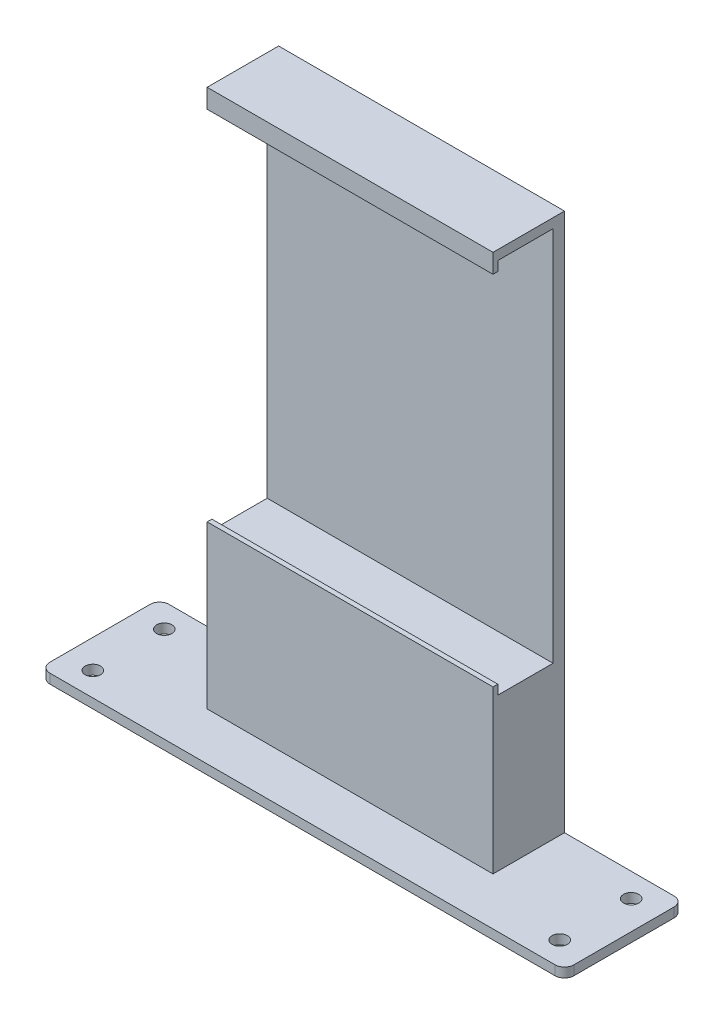
ISO-10303-21;
HEADER;
FILE_DESCRIPTION(('STEP AP214'),'2;1');
FILE_NAME('part.step','',(''),(''),'','','');
FILE_SCHEMA(('AUTOMOTIVE_DESIGN { 1 0 10303 214 1 1 1 1 }'));
ENDSEC;
DATA;
#1=APPLICATION_CONTEXT('core data for automotive mechanical design processes');
#2=APPLICATION_PROTOCOL_DEFINITION('international standard','automotive_design',2000,#1);
#3=PRODUCT_CONTEXT('',#1,'mechanical');
#4=PRODUCT('Part','Part','',(#3));
#5=PRODUCT_RELATED_PRODUCT_CATEGORY('part','',(#4));
#6=PRODUCT_DEFINITION_FORMATION('','',#4);
#7=PRODUCT_DEFINITION_CONTEXT('part definition',#1,'design');
#8=PRODUCT_DEFINITION('design','',#6,#7);
#9=PRODUCT_DEFINITION_SHAPE('','',#8);
#10=(LENGTH_UNIT() NAMED_UNIT(*) SI_UNIT(.MILLI.,.METRE.));
#11=(NAMED_UNIT(*) PLANE_ANGLE_UNIT() SI_UNIT($,.RADIAN.));
#12=(NAMED_UNIT(*) SI_UNIT($,.STERADIAN.) SOLID_ANGLE_UNIT());
#13=UNCERTAINTY_MEASURE_WITH_UNIT(LENGTH_MEASURE(1.E-05),#10,'distance_accuracy_value','');
#14=(GEOMETRIC_REPRESENTATION_CONTEXT(3) GLOBAL_UNCERTAINTY_ASSIGNED_CONTEXT((#13)) GLOBAL_UNIT_ASSIGNED_CONTEXT((#10,
#11,#12)) REPRESENTATION_CONTEXT('',''));
#15=CARTESIAN_POINT('',(0.,0.,0.));
#16=DIRECTION('',(0.,0.,1.));
#17=DIRECTION('',(1.,0.,0.));
#18=AXIS2_PLACEMENT_3D('',#15,#16,#17);
#19=CARTESIAN_POINT('',(-30.,-59.8465843842649,2.5));
#20=DIRECTION('',(0.,0.,1.));
#21=DIRECTION('',(1.,0.,0.));
#22=AXIS2_PLACEMENT_3D('',#19,#20,#21);
#23=PLANE('',#22);
#24=DIRECTION('',(1.,0.,0.));
#25=VECTOR('',#24,1.);
#26=CARTESIAN_POINT('',(-109.998499985937,36.,2.5));
#27=LINE('',#26,#25);
#28=CARTESIAN_POINT('',(-30.,36.,2.5));
#29=VERTEX_POINT('',#28);
#30=CARTESIAN_POINT('',(30.,36.,2.5));
#31=VERTEX_POINT('',#30);
#32=EDGE_CURVE('E224',#29,#31,#27,.T.);
#33=ORIENTED_EDGE('',*,*,#32,.F.);
#34=DIRECTION('',(0.,1.,0.));
#35=VECTOR('',#34,1.);
#36=CARTESIAN_POINT('',(-30.,-59.8465843842649,2.5));
#37=LINE('',#36,#35);
#38=CARTESIAN_POINT('',(-30.,2.,2.5));
#39=VERTEX_POINT('',#38);
#40=EDGE_CURVE('E195',#39,#29,#37,.T.);
#41=ORIENTED_EDGE('',*,*,#40,.F.);
#42=DIRECTION('',(-1.,0.,0.));
#43=VECTOR('',#42,1.);
#44=CARTESIAN_POINT('',(-30.,2.,2.5));
#45=LINE('',#44,#43);
#46=CARTESIAN_POINT('',(30.,2.,2.5));
#47=VERTEX_POINT('',#46);
#48=EDGE_CURVE('E232',#47,#39,#45,.T.);
#49=ORIENTED_EDGE('',*,*,#48,.F.);
#50=DIRECTION('',(0.,1.,0.));
#51=VECTOR('',#50,1.);
#52=CARTESIAN_POINT('',(30.,-59.8465843842649,2.5));
#53=LINE('',#52,#51);
#54=EDGE_CURVE('E253',#47,#31,#53,.T.);
#55=ORIENTED_EDGE('',*,*,#54,.T.);
#56=EDGE_LOOP('',(#33,#41,#49,#55));
#57=FACE_BOUND('',#56,.T.);
#58=ADVANCED_FACE('F36',(#57),#23,.T.);
#59=CARTESIAN_POINT('',(0.,2.,0.));
#60=DIRECTION('',(0.,1.,0.));
#61=DIRECTION('',(0.,0.,1.));
#62=AXIS2_PLACEMENT_3D('',#59,#60,#61);
#63=PLANE('',#62);
#64=CARTESIAN_POINT('',(49.,2.,7.5));
#65=DIRECTION('',(0.,1.,0.));
#66=DIRECTION('',(0.,0.,1.));
#67=AXIS2_PLACEMENT_3D('',#64,#65,#66);
#68=CIRCLE('',#67,1.6);
#69=CARTESIAN_POINT('',(49.,2.,9.1));
#70=VERTEX_POINT('',#69);
#71=EDGE_CURVE('E269',#70,#70,#68,.T.);
#72=ORIENTED_EDGE('',*,*,#71,.F.);
#73=EDGE_LOOP('',(#72));
#74=FACE_BOUND('',#73,.T.);
#75=CARTESIAN_POINT('',(-49.,2.,-7.5));
#76=DIRECTION('',(0.,1.,0.));
#77=DIRECTION('',(0.,0.,1.));
#78=AXIS2_PLACEMENT_3D('',#75,#76,#77);
#79=CIRCLE('',#78,1.6);
#80=CARTESIAN_POINT('',(-49.,2.,-5.9));
#81=VERTEX_POINT('',#80);
#82=EDGE_CURVE('E281',#81,#81,#79,.T.);
#83=ORIENTED_EDGE('',*,*,#82,.F.);
#84=EDGE_LOOP('',(#83));
#85=FACE_BOUND('',#84,.T.);
#86=CARTESIAN_POINT('',(49.,2.,-7.5));
#87=DIRECTION('',(0.,1.,0.));
#88=DIRECTION('',(0.,0.,-1.));
#89=AXIS2_PLACEMENT_3D('',#86,#87,#88);
#90=CIRCLE('',#89,1.6);
#91=CARTESIAN_POINT('',(49.,2.,-9.1));
#92=VERTEX_POINT('',#91);
#93=EDGE_CURVE('E275',#92,#92,#90,.T.);
#94=ORIENTED_EDGE('',*,*,#93,.F.);
#95=EDGE_LOOP('',(#94));
#96=FACE_BOUND('',#95,.T.);
#97=CARTESIAN_POINT('',(-49.,2.,7.5));
#98=DIRECTION('',(0.,1.,0.));
#99=DIRECTION('',(0.,0.,-1.));
#100=AXIS2_PLACEMENT_3D('',#97,#98,#99);
#101=CIRCLE('',#100,1.6);
#102=CARTESIAN_POINT('',(-49.,2.,5.9));
#103=VERTEX_POINT('',#102);
#104=EDGE_CURVE('E263',#103,#103,#101,.T.);
#105=ORIENTED_EDGE('',*,*,#104,.F.);
#106=EDGE_LOOP('',(#105));
#107=FACE_BOUND('',#106,.T.);
#108=DIRECTION('',(0.,0.,1.));
#109=VECTOR('',#108,1.);
#110=CARTESIAN_POINT('',(-55.,2.,-12.5));
#111=LINE('',#110,#109);
#112=CARTESIAN_POINT('',(-55.,2.,-10.5));
#113=VERTEX_POINT('',#112);
#114=CARTESIAN_POINT('',(-55.,2.,10.5));
#115=VERTEX_POINT('',#114);
#116=EDGE_CURVE('E294',#113,#115,#111,.T.);
#117=ORIENTED_EDGE('',*,*,#116,.T.);
#118=CARTESIAN_POINT('',(-53.,2.,10.5));
#119=DIRECTION('',(0.,1.,0.));
#120=DIRECTION('',(0.,0.,1.));
#121=AXIS2_PLACEMENT_3D('',#118,#119,#120);
#122=CIRCLE('',#121,2.);
#123=CARTESIAN_POINT('',(-53.,2.,12.5));
#124=VERTEX_POINT('',#123);
#125=EDGE_CURVE('E11',#115,#124,#122,.T.);
#126=ORIENTED_EDGE('',*,*,#125,.T.);
#127=DIRECTION('',(1.,0.,0.));
#128=VECTOR('',#127,1.);
#129=CARTESIAN_POINT('',(-55.,2.,12.5));
#130=LINE('',#129,#128);
#131=CARTESIAN_POINT('',(53.,2.,12.5));
#132=VERTEX_POINT('',#131);
#133=EDGE_CURVE('E296',#124,#132,#130,.T.);
#134=ORIENTED_EDGE('',*,*,#133,.T.);
#135=CARTESIAN_POINT('',(53.,2.,10.5));
#136=DIRECTION('',(0.,1.,0.));
#137=DIRECTION('',(0.,0.,1.));
#138=AXIS2_PLACEMENT_3D('',#135,#136,#137);
#139=CIRCLE('',#138,2.);
#140=CARTESIAN_POINT('',(55.,2.,10.5));
#141=VERTEX_POINT('',#140);
#142=EDGE_CURVE('E315',#132,#141,#139,.T.);
#143=ORIENTED_EDGE('',*,*,#142,.T.);
#144=DIRECTION('',(0.,0.,-1.));
#145=VECTOR('',#144,1.);
#146=CARTESIAN_POINT('',(55.,2.,-12.5));
#147=LINE('',#146,#145);
#148=CARTESIAN_POINT('',(55.,2.,-10.5));
#149=VERTEX_POINT('',#148);
#150=EDGE_CURVE('E287',#141,#149,#147,.T.);
#151=ORIENTED_EDGE('',*,*,#150,.T.);
#152=CARTESIAN_POINT('',(53.,2.,-10.5));
#153=DIRECTION('',(0.,1.,0.));
#154=DIRECTION('',(0.,0.,1.));
#155=AXIS2_PLACEMENT_3D('',#152,#153,#154);
#156=CIRCLE('',#155,2.);
#157=CARTESIAN_POINT('',(53.,2.,-12.5));
#158=VERTEX_POINT('',#157);
#159=EDGE_CURVE('E324',#149,#158,#156,.T.);
#160=ORIENTED_EDGE('',*,*,#159,.T.);
#161=DIRECTION('',(-1.,0.,0.));
#162=VECTOR('',#161,1.);
#163=CARTESIAN_POINT('',(-55.,2.,-12.5));
#164=LINE('',#163,#162);
#165=CARTESIAN_POINT('',(30.,2.,-12.5));
#166=VERTEX_POINT('',#165);
#167=EDGE_CURVE('E292',#158,#166,#164,.T.);
#168=ORIENTED_EDGE('',*,*,#167,.T.);
#169=DIRECTION('',(0.,0.,1.));
#170=VECTOR('',#169,1.);
#171=CARTESIAN_POINT('',(30.,2.,2.5));
#172=LINE('',#171,#170);
#173=EDGE_CURVE('E235',#166,#47,#172,.T.);
#174=ORIENTED_EDGE('',*,*,#173,.T.);
#175=ORIENTED_EDGE('',*,*,#48,.T.);
#176=DIRECTION('',(0.,0.,-1.));
#177=VECTOR('',#176,1.);
#178=CARTESIAN_POINT('',(-30.,2.,-12.5));
#179=LINE('',#178,#177);
#180=CARTESIAN_POINT('',(-30.,2.,-12.5));
#181=VERTEX_POINT('',#180);
#182=EDGE_CURVE('E239',#39,#181,#179,.T.);
#183=ORIENTED_EDGE('',*,*,#182,.T.);
#184=CARTESIAN_POINT('',(-53.,2.,-12.5));
#185=VERTEX_POINT('',#184);
#186=EDGE_CURVE('E290',#181,#185,#164,.T.);
#187=ORIENTED_EDGE('',*,*,#186,.T.);
#188=CARTESIAN_POINT('',(-53.,2.,-10.5));
#189=DIRECTION('',(0.,1.,0.));
#190=DIRECTION('',(0.,0.,1.));
#191=AXIS2_PLACEMENT_3D('',#188,#189,#190);
#192=CIRCLE('',#191,2.);
#193=EDGE_CURVE('E333',#185,#113,#192,.T.);
#194=ORIENTED_EDGE('',*,*,#193,.T.);
#195=EDGE_LOOP('',(#117,#126,#134,#143,#151,#160,#168,#174,#175,#183,#187,#194));
#196=FACE_BOUND('',#195,.T.);
#197=ADVANCED_FACE('F354',(#74,#85,#96,#107,#196),#63,.T.);
#198=CARTESIAN_POINT('',(0.,0.,0.));
#199=DIRECTION('',(0.,1.,0.));
#200=DIRECTION('',(0.,0.,1.));
#201=AXIS2_PLACEMENT_3D('',#198,#199,#200);
#202=PLANE('',#201);
#203=DIRECTION('',(1.,0.,0.));
#204=VECTOR('',#203,1.);
#205=CARTESIAN_POINT('',(-55.,0.,12.5));
#206=LINE('',#205,#204);
#207=CARTESIAN_POINT('',(-53.,0.,12.5));
#208=VERTEX_POINT('',#207);
#209=CARTESIAN_POINT('',(53.,0.,12.5));
#210=VERTEX_POINT('',#209);
#211=EDGE_CURVE('E291',#208,#210,#206,.T.);
#212=ORIENTED_EDGE('',*,*,#211,.F.);
#213=CARTESIAN_POINT('',(-53.,0.,10.5));
#214=DIRECTION('',(0.,1.,0.));
#215=DIRECTION('',(0.,0.,1.));
#216=AXIS2_PLACEMENT_3D('',#213,#214,#215);
#217=CIRCLE('',#216,2.);
#218=CARTESIAN_POINT('',(-55.,0.,10.5));
#219=VERTEX_POINT('',#218);
#220=EDGE_CURVE('E58',#208,#219,#217,.F.);
#221=ORIENTED_EDGE('',*,*,#220,.T.);
#222=DIRECTION('',(0.,0.,1.));
#223=VECTOR('',#222,1.);
#224=CARTESIAN_POINT('',(-55.,0.,-12.5));
#225=LINE('',#224,#223);
#226=CARTESIAN_POINT('',(-55.,0.,-10.5));
#227=VERTEX_POINT('',#226);
#228=EDGE_CURVE('E304',#227,#219,#225,.T.);
#229=ORIENTED_EDGE('',*,*,#228,.F.);
#230=CARTESIAN_POINT('',(-53.,0.,-10.5));
#231=DIRECTION('',(0.,1.,0.));
#232=DIRECTION('',(0.,0.,1.));
#233=AXIS2_PLACEMENT_3D('',#230,#231,#232);
#234=CIRCLE('',#233,2.);
#235=CARTESIAN_POINT('',(-53.,0.,-12.5));
#236=VERTEX_POINT('',#235);
#237=EDGE_CURVE('E329',#227,#236,#234,.F.);
#238=ORIENTED_EDGE('',*,*,#237,.T.);
#239=DIRECTION('',(-1.,0.,0.));
#240=VECTOR('',#239,1.);
#241=CARTESIAN_POINT('',(-55.,0.,-12.5));
#242=LINE('',#241,#240);
#243=CARTESIAN_POINT('',(53.,0.,-12.5));
#244=VERTEX_POINT('',#243);
#245=EDGE_CURVE('E301',#244,#236,#242,.T.);
#246=ORIENTED_EDGE('',*,*,#245,.F.);
#247=CARTESIAN_POINT('',(53.,0.,-10.5));
#248=DIRECTION('',(0.,1.,0.));
#249=DIRECTION('',(0.,0.,1.));
#250=AXIS2_PLACEMENT_3D('',#247,#248,#249);
#251=CIRCLE('',#250,2.);
#252=CARTESIAN_POINT('',(55.,0.,-10.5));
#253=VERTEX_POINT('',#252);
#254=EDGE_CURVE('E320',#244,#253,#251,.F.);
#255=ORIENTED_EDGE('',*,*,#254,.T.);
#256=DIRECTION('',(0.,0.,-1.));
#257=VECTOR('',#256,1.);
#258=CARTESIAN_POINT('',(55.,0.,-12.5));
#259=LINE('',#258,#257);
#260=CARTESIAN_POINT('',(55.,0.,10.5));
#261=VERTEX_POINT('',#260);
#262=EDGE_CURVE('E284',#261,#253,#259,.T.);
#263=ORIENTED_EDGE('',*,*,#262,.F.);
#264=CARTESIAN_POINT('',(53.,0.,10.5));
#265=DIRECTION('',(0.,1.,0.));
#266=DIRECTION('',(0.,0.,1.));
#267=AXIS2_PLACEMENT_3D('',#264,#265,#266);
#268=CIRCLE('',#267,2.);
#269=EDGE_CURVE('E309',#261,#210,#268,.F.);
#270=ORIENTED_EDGE('',*,*,#269,.T.);
#271=EDGE_LOOP('',(#212,#221,#229,#238,#246,#255,#263,#270));
#272=FACE_BOUND('',#271,.T.);
#273=CARTESIAN_POINT('',(-49.,0.,-7.5));
#274=DIRECTION('',(0.,1.,0.));
#275=DIRECTION('',(0.,0.,1.));
#276=AXIS2_PLACEMENT_3D('',#273,#274,#275);
#277=CIRCLE('',#276,1.6);
#278=CARTESIAN_POINT('',(-49.,0.,-5.9));
#279=VERTEX_POINT('',#278);
#280=EDGE_CURVE('E278',#279,#279,#277,.T.);
#281=ORIENTED_EDGE('',*,*,#280,.T.);
#282=EDGE_LOOP('',(#281));
#283=FACE_BOUND('',#282,.T.);
#284=CARTESIAN_POINT('',(49.,0.,-7.5));
#285=DIRECTION('',(0.,1.,0.));
#286=DIRECTION('',(0.,0.,-1.));
#287=AXIS2_PLACEMENT_3D('',#284,#285,#286);
#288=CIRCLE('',#287,1.6);
#289=CARTESIAN_POINT('',(49.,0.,-9.1));
#290=VERTEX_POINT('',#289);
#291=EDGE_CURVE('E272',#290,#290,#288,.T.);
#292=ORIENTED_EDGE('',*,*,#291,.T.);
#293=EDGE_LOOP('',(#292));
#294=FACE_BOUND('',#293,.T.);
#295=CARTESIAN_POINT('',(49.,0.,7.5));
#296=DIRECTION('',(0.,1.,0.));
#297=DIRECTION('',(0.,0.,1.));
#298=AXIS2_PLACEMENT_3D('',#295,#296,#297);
#299=CIRCLE('',#298,1.6);
#300=CARTESIAN_POINT('',(49.,0.,9.1));
#301=VERTEX_POINT('',#300);
#302=EDGE_CURVE('E266',#301,#301,#299,.T.);
#303=ORIENTED_EDGE('',*,*,#302,.T.);
#304=EDGE_LOOP('',(#303));
#305=FACE_BOUND('',#304,.T.);
#306=CARTESIAN_POINT('',(-49.,0.,7.5));
#307=DIRECTION('',(0.,1.,0.));
#308=DIRECTION('',(0.,0.,-1.));
#309=AXIS2_PLACEMENT_3D('',#306,#307,#308);
#310=CIRCLE('',#309,1.6);
#311=CARTESIAN_POINT('',(-49.,0.,5.9));
#312=VERTEX_POINT('',#311);
#313=EDGE_CURVE('E262',#312,#312,#310,.T.);
#314=ORIENTED_EDGE('',*,*,#313,.T.);
#315=EDGE_LOOP('',(#314));
#316=FACE_BOUND('',#315,.T.);
#317=ADVANCED_FACE('F344',(#272,#283,#294,#305,#316),#202,.F.);
#318=CARTESIAN_POINT('',(55.,2.,-12.5));
#319=DIRECTION('',(-1.,0.,0.));
#320=DIRECTION('',(0.,0.,1.));
#321=AXIS2_PLACEMENT_3D('',#318,#319,#320);
#322=PLANE('',#321);
#323=ORIENTED_EDGE('',*,*,#262,.T.);
#324=DIRECTION('',(0.,-1.,0.));
#325=VECTOR('',#324,1.);
#326=CARTESIAN_POINT('',(55.,2.,-10.5));
#327=LINE('',#326,#325);
#328=EDGE_CURVE('E322',#253,#149,#327,.F.);
#329=ORIENTED_EDGE('',*,*,#328,.T.);
#330=ORIENTED_EDGE('',*,*,#150,.F.);
#331=DIRECTION('',(0.,-1.,0.));
#332=VECTOR('',#331,1.);
#333=CARTESIAN_POINT('',(55.,2.,10.5));
#334=LINE('',#333,#332);
#335=EDGE_CURVE('E298',#141,#261,#334,.T.);
#336=ORIENTED_EDGE('',*,*,#335,.T.);
#337=EDGE_LOOP('',(#323,#329,#330,#336));
#338=FACE_BOUND('',#337,.T.);
#339=ADVANCED_FACE('F357',(#338),#322,.F.);
#340=CARTESIAN_POINT('',(-55.,2.,-12.5));
#341=DIRECTION('',(0.,0.,1.));
#342=DIRECTION('',(1.,0.,0.));
#343=AXIS2_PLACEMENT_3D('',#340,#341,#342);
#344=PLANE('',#343);
#345=ORIENTED_EDGE('',*,*,#245,.T.);
#346=DIRECTION('',(0.,-1.,0.));
#347=VECTOR('',#346,1.);
#348=CARTESIAN_POINT('',(-53.,2.,-12.5));
#349=LINE('',#348,#347);
#350=EDGE_CURVE('E331',#236,#185,#349,.F.);
#351=ORIENTED_EDGE('',*,*,#350,.T.);
#352=ORIENTED_EDGE('',*,*,#186,.F.);
#353=DIRECTION('',(0.,1.,0.));
#354=VECTOR('',#353,1.);
#355=CARTESIAN_POINT('',(-30.,-59.8465843842649,-12.5));
#356=LINE('',#355,#354);
#357=CARTESIAN_POINT('',(-30.,115.,-12.5));
#358=VERTEX_POINT('',#357);
#359=EDGE_CURVE('E251',#181,#358,#356,.T.);
#360=ORIENTED_EDGE('',*,*,#359,.T.);
#361=DIRECTION('',(-1.,0.,0.));
#362=VECTOR('',#361,1.);
#363=CARTESIAN_POINT('',(30.,115.,-12.5));
#364=LINE('',#363,#362);
#365=CARTESIAN_POINT('',(30.,115.,-12.5));
#366=VERTEX_POINT('',#365);
#367=EDGE_CURVE('E231',#366,#358,#364,.T.);
#368=ORIENTED_EDGE('',*,*,#367,.F.);
#369=DIRECTION('',(0.,1.,0.));
#370=VECTOR('',#369,1.);
#371=CARTESIAN_POINT('',(30.,-59.8465843842649,-12.5));
#372=LINE('',#371,#370);
#373=EDGE_CURVE('E236',#166,#366,#372,.T.);
#374=ORIENTED_EDGE('',*,*,#373,.F.);
#375=ORIENTED_EDGE('',*,*,#167,.F.);
#376=DIRECTION('',(0.,-1.,0.));
#377=VECTOR('',#376,1.);
#378=CARTESIAN_POINT('',(53.,2.,-12.5));
#379=LINE('',#378,#377);
#380=EDGE_CURVE('E317',#158,#244,#379,.T.);
#381=ORIENTED_EDGE('',*,*,#380,.T.);
#382=EDGE_LOOP('',(#345,#351,#352,#360,#368,#374,#375,#381));
#383=FACE_BOUND('',#382,.T.);
#384=ADVANCED_FACE('F366',(#383),#344,.F.);
#385=CARTESIAN_POINT('',(-55.,2.,-12.5));
#386=DIRECTION('',(1.,0.,0.));
#387=DIRECTION('',(0.,0.,-1.));
#388=AXIS2_PLACEMENT_3D('',#385,#386,#387);
#389=PLANE('',#388);
#390=ORIENTED_EDGE('',*,*,#228,.T.);
#391=DIRECTION('',(0.,-1.,0.));
#392=VECTOR('',#391,1.);
#393=CARTESIAN_POINT('',(-55.,2.,10.5));
#394=LINE('',#393,#392);
#395=EDGE_CURVE('E44',#219,#115,#394,.F.);
#396=ORIENTED_EDGE('',*,*,#395,.T.);
#397=ORIENTED_EDGE('',*,*,#116,.F.);
#398=DIRECTION('',(0.,-1.,0.));
#399=VECTOR('',#398,1.);
#400=CARTESIAN_POINT('',(-55.,2.,-10.5));
#401=LINE('',#400,#399);
#402=EDGE_CURVE('E326',#113,#227,#401,.T.);
#403=ORIENTED_EDGE('',*,*,#402,.T.);
#404=EDGE_LOOP('',(#390,#396,#397,#403));
#405=FACE_BOUND('',#404,.T.);
#406=ADVANCED_FACE('F383',(#405),#389,.F.);
#407=CARTESIAN_POINT('',(-55.,2.,12.5));
#408=DIRECTION('',(0.,0.,-1.));
#409=DIRECTION('',(-1.,0.,0.));
#410=AXIS2_PLACEMENT_3D('',#407,#408,#409);
#411=PLANE('',#410);
#412=ORIENTED_EDGE('',*,*,#133,.F.);
#413=DIRECTION('',(0.,-1.,0.));
#414=VECTOR('',#413,1.);
#415=CARTESIAN_POINT('',(-53.,2.,12.5));
#416=LINE('',#415,#414);
#417=EDGE_CURVE('E335',#124,#208,#416,.T.);
#418=ORIENTED_EDGE('',*,*,#417,.T.);
#419=ORIENTED_EDGE('',*,*,#211,.T.);
#420=DIRECTION('',(0.,-1.,0.));
#421=VECTOR('',#420,1.);
#422=CARTESIAN_POINT('',(53.,2.,12.5));
#423=LINE('',#422,#421);
#424=EDGE_CURVE('E312',#210,#132,#423,.F.);
#425=ORIENTED_EDGE('',*,*,#424,.T.);
#426=EDGE_LOOP('',(#412,#418,#419,#425));
#427=FACE_BOUND('',#426,.T.);
#428=ADVANCED_FACE('F341',(#427),#411,.F.);
#429=CARTESIAN_POINT('',(-49.,2.,-7.5));
#430=DIRECTION('',(0.,-1.,0.));
#431=DIRECTION('',(0.,0.,-1.));
#432=AXIS2_PLACEMENT_3D('',#429,#430,#431);
#433=CYLINDRICAL_SURFACE('',#432,1.6);
#434=ORIENTED_EDGE('',*,*,#82,.T.);
#435=EDGE_LOOP('',(#434));
#436=FACE_BOUND('',#435,.T.);
#437=ORIENTED_EDGE('',*,*,#280,.F.);
#438=EDGE_LOOP('',(#437));
#439=FACE_BOUND('',#438,.T.);
#440=ADVANCED_FACE('F567',(#436,#439),#433,.F.);
#441=CARTESIAN_POINT('',(49.,2.,-7.5));
#442=DIRECTION('',(0.,-1.,0.));
#443=DIRECTION('',(0.,0.,-1.));
#444=AXIS2_PLACEMENT_3D('',#441,#442,#443);
#445=CYLINDRICAL_SURFACE('',#444,1.6);
#446=ORIENTED_EDGE('',*,*,#93,.T.);
#447=EDGE_LOOP('',(#446));
#448=FACE_BOUND('',#447,.T.);
#449=ORIENTED_EDGE('',*,*,#291,.F.);
#450=EDGE_LOOP('',(#449));
#451=FACE_BOUND('',#450,.T.);
#452=ADVANCED_FACE('F580',(#448,#451),#445,.F.);
#453=CARTESIAN_POINT('',(49.,2.,7.5));
#454=DIRECTION('',(0.,-1.,0.));
#455=DIRECTION('',(0.,0.,-1.));
#456=AXIS2_PLACEMENT_3D('',#453,#454,#455);
#457=CYLINDRICAL_SURFACE('',#456,1.6);
#458=ORIENTED_EDGE('',*,*,#71,.T.);
#459=EDGE_LOOP('',(#458));
#460=FACE_BOUND('',#459,.T.);
#461=ORIENTED_EDGE('',*,*,#302,.F.);
#462=EDGE_LOOP('',(#461));
#463=FACE_BOUND('',#462,.T.);
#464=ADVANCED_FACE('F587',(#460,#463),#457,.F.);
#465=CARTESIAN_POINT('',(-49.,2.,7.5));
#466=DIRECTION('',(0.,-1.,0.));
#467=DIRECTION('',(0.,0.,-1.));
#468=AXIS2_PLACEMENT_3D('',#465,#466,#467);
#469=CYLINDRICAL_SURFACE('',#468,1.6);
#470=ORIENTED_EDGE('',*,*,#104,.T.);
#471=EDGE_LOOP('',(#470));
#472=FACE_BOUND('',#471,.T.);
#473=ORIENTED_EDGE('',*,*,#313,.F.);
#474=EDGE_LOOP('',(#473));
#475=FACE_BOUND('',#474,.T.);
#476=ADVANCED_FACE('F405',(#472,#475),#469,.F.);
#477=CARTESIAN_POINT('',(30.,-59.8465843842649,2.5));
#478=DIRECTION('',(1.,0.,0.));
#479=DIRECTION('',(0.,0.,-1.));
#480=AXIS2_PLACEMENT_3D('',#477,#478,#479);
#481=PLANE('',#480);
#482=DIRECTION('',(0.,0.,-1.));
#483=VECTOR('',#482,1.);
#484=CARTESIAN_POINT('',(30.,36.,2.5));
#485=LINE('',#484,#483);
#486=CARTESIAN_POINT('',(30.,36.,1.5));
#487=VERTEX_POINT('',#486);
#488=EDGE_CURVE('E189',#31,#487,#485,.T.);
#489=ORIENTED_EDGE('',*,*,#488,.F.);
#490=ORIENTED_EDGE('',*,*,#54,.F.);
#491=ORIENTED_EDGE('',*,*,#173,.F.);
#492=ORIENTED_EDGE('',*,*,#373,.T.);
#493=DIRECTION('',(0.,0.,-1.));
#494=VECTOR('',#493,1.);
#495=CARTESIAN_POINT('',(30.,115.,2.5));
#496=LINE('',#495,#494);
#497=CARTESIAN_POINT('',(30.,115.,2.5));
#498=VERTEX_POINT('',#497);
#499=EDGE_CURVE('E248',#498,#366,#496,.T.);
#500=ORIENTED_EDGE('',*,*,#499,.F.);
#501=CARTESIAN_POINT('',(30.,111.,2.5));
#502=VERTEX_POINT('',#501);
#503=EDGE_CURVE('E256',#502,#498,#53,.T.);
#504=ORIENTED_EDGE('',*,*,#503,.F.);
#505=DIRECTION('',(0.,0.,1.));
#506=VECTOR('',#505,1.);
#507=CARTESIAN_POINT('',(30.,111.,1.49999999999999));
#508=LINE('',#507,#506);
#509=CARTESIAN_POINT('',(30.,111.,1.49999999999999));
#510=VERTEX_POINT('',#509);
#511=EDGE_CURVE('E196',#510,#502,#508,.T.);
#512=ORIENTED_EDGE('',*,*,#511,.F.);
#513=DIRECTION('',(0.,-1.,0.));
#514=VECTOR('',#513,1.);
#515=CARTESIAN_POINT('',(30.,113.,1.49999999999999));
#516=LINE('',#515,#514);
#517=CARTESIAN_POINT('',(30.,113.,1.49999999999999));
#518=VERTEX_POINT('',#517);
#519=EDGE_CURVE('E198',#518,#510,#516,.T.);
#520=ORIENTED_EDGE('',*,*,#519,.F.);
#521=DIRECTION('',(0.,0.,1.));
#522=VECTOR('',#521,1.);
#523=CARTESIAN_POINT('',(30.,113.,-10.1));
#524=LINE('',#523,#522);
#525=CARTESIAN_POINT('',(30.,113.,-10.1));
#526=VERTEX_POINT('',#525);
#527=EDGE_CURVE('E419',#526,#518,#524,.T.);
#528=ORIENTED_EDGE('',*,*,#527,.F.);
#529=DIRECTION('',(0.,1.,0.));
#530=VECTOR('',#529,1.);
#531=CARTESIAN_POINT('',(30.,34.,-10.1));
#532=LINE('',#531,#530);
#533=CARTESIAN_POINT('',(30.,34.,-10.1));
#534=VERTEX_POINT('',#533);
#535=EDGE_CURVE('E421',#534,#526,#532,.T.);
#536=ORIENTED_EDGE('',*,*,#535,.F.);
#537=DIRECTION('',(0.,0.,-1.));
#538=VECTOR('',#537,1.);
#539=CARTESIAN_POINT('',(30.,34.,1.5));
#540=LINE('',#539,#538);
#541=CARTESIAN_POINT('',(30.,34.,1.5));
#542=VERTEX_POINT('',#541);
#543=EDGE_CURVE('E426',#542,#534,#540,.T.);
#544=ORIENTED_EDGE('',*,*,#543,.F.);
#545=DIRECTION('',(0.,-1.,0.));
#546=VECTOR('',#545,1.);
#547=CARTESIAN_POINT('',(30.,36.,1.5));
#548=LINE('',#547,#546);
#549=EDGE_CURVE('E428',#487,#542,#548,.T.);
#550=ORIENTED_EDGE('',*,*,#549,.F.);
#551=EDGE_LOOP('',(#489,#490,#491,#492,#500,#504,#512,#520,#528,#536,#544,#550));
#552=FACE_BOUND('',#551,.T.);
#553=ADVANCED_FACE('F371',(#552),#481,.T.);
#554=DIRECTION('',(1.,0.,0.));
#555=VECTOR('',#554,1.);
#556=CARTESIAN_POINT('',(-109.998499985937,111.,2.5));
#557=LINE('',#556,#555);
#558=CARTESIAN_POINT('',(-30.,111.,2.5));
#559=VERTEX_POINT('',#558);
#560=EDGE_CURVE('E206',#559,#502,#557,.T.);
#561=ORIENTED_EDGE('',*,*,#560,.T.);
#562=ORIENTED_EDGE('',*,*,#503,.T.);
#563=DIRECTION('',(1.,0.,0.));
#564=VECTOR('',#563,1.);
#565=CARTESIAN_POINT('',(-30.,115.,2.5));
#566=LINE('',#565,#564);
#567=CARTESIAN_POINT('',(-30.,115.,2.5));
#568=VERTEX_POINT('',#567);
#569=EDGE_CURVE('E245',#568,#498,#566,.T.);
#570=ORIENTED_EDGE('',*,*,#569,.F.);
#571=EDGE_CURVE('E258',#559,#568,#37,.T.);
#572=ORIENTED_EDGE('',*,*,#571,.F.);
#573=EDGE_LOOP('',(#561,#562,#570,#572));
#574=FACE_BOUND('',#573,.T.);
#575=ADVANCED_FACE('F390',(#574),#23,.T.);
#576=CARTESIAN_POINT('',(-30.,-59.8465843842649,-12.5));
#577=DIRECTION('',(-1.,0.,0.));
#578=DIRECTION('',(0.,0.,1.));
#579=AXIS2_PLACEMENT_3D('',#576,#577,#578);
#580=PLANE('',#579);
#581=DIRECTION('',(0.,0.,-1.));
#582=VECTOR('',#581,1.);
#583=CARTESIAN_POINT('',(-30.,36.,2.5));
#584=LINE('',#583,#582);
#585=CARTESIAN_POINT('',(-30.,36.,1.5));
#586=VERTEX_POINT('',#585);
#587=EDGE_CURVE('E186',#29,#586,#584,.T.);
#588=ORIENTED_EDGE('',*,*,#587,.T.);
#589=DIRECTION('',(0.,-1.,0.));
#590=VECTOR('',#589,1.);
#591=CARTESIAN_POINT('',(-30.,36.,1.5));
#592=LINE('',#591,#590);
#593=CARTESIAN_POINT('',(-30.,34.,1.5));
#594=VERTEX_POINT('',#593);
#595=EDGE_CURVE('E173',#586,#594,#592,.T.);
#596=ORIENTED_EDGE('',*,*,#595,.T.);
#597=DIRECTION('',(0.,0.,-1.));
#598=VECTOR('',#597,1.);
#599=CARTESIAN_POINT('',(-30.,34.,1.5));
#600=LINE('',#599,#598);
#601=CARTESIAN_POINT('',(-30.,34.,-10.1));
#602=VERTEX_POINT('',#601);
#603=EDGE_CURVE('E220',#594,#602,#600,.T.);
#604=ORIENTED_EDGE('',*,*,#603,.T.);
#605=DIRECTION('',(0.,1.,0.));
#606=VECTOR('',#605,1.);
#607=CARTESIAN_POINT('',(-30.,34.,-10.1));
#608=LINE('',#607,#606);
#609=CARTESIAN_POINT('',(-30.,113.,-10.1));
#610=VERTEX_POINT('',#609);
#611=EDGE_CURVE('E216',#602,#610,#608,.T.);
#612=ORIENTED_EDGE('',*,*,#611,.T.);
#613=DIRECTION('',(0.,0.,1.));
#614=VECTOR('',#613,1.);
#615=CARTESIAN_POINT('',(-30.,113.,-10.1));
#616=LINE('',#615,#614);
#617=CARTESIAN_POINT('',(-30.,113.,1.49999999999999));
#618=VERTEX_POINT('',#617);
#619=EDGE_CURVE('E212',#610,#618,#616,.T.);
#620=ORIENTED_EDGE('',*,*,#619,.T.);
#621=DIRECTION('',(0.,-1.,0.));
#622=VECTOR('',#621,1.);
#623=CARTESIAN_POINT('',(-30.,113.,1.49999999999999));
#624=LINE('',#623,#622);
#625=CARTESIAN_POINT('',(-30.,111.,1.49999999999999));
#626=VERTEX_POINT('',#625);
#627=EDGE_CURVE('E208',#618,#626,#624,.T.);
#628=ORIENTED_EDGE('',*,*,#627,.T.);
#629=DIRECTION('',(0.,0.,1.));
#630=VECTOR('',#629,1.);
#631=CARTESIAN_POINT('',(-30.,111.,1.49999999999999));
#632=LINE('',#631,#630);
#633=EDGE_CURVE('E203',#626,#559,#632,.T.);
#634=ORIENTED_EDGE('',*,*,#633,.T.);
#635=ORIENTED_EDGE('',*,*,#571,.T.);
#636=DIRECTION('',(0.,0.,1.));
#637=VECTOR('',#636,1.);
#638=CARTESIAN_POINT('',(-30.,115.,-12.5));
#639=LINE('',#638,#637);
#640=EDGE_CURVE('E242',#358,#568,#639,.T.);
#641=ORIENTED_EDGE('',*,*,#640,.F.);
#642=ORIENTED_EDGE('',*,*,#359,.F.);
#643=ORIENTED_EDGE('',*,*,#182,.F.);
#644=ORIENTED_EDGE('',*,*,#40,.T.);
#645=EDGE_LOOP('',(#588,#596,#604,#612,#620,#628,#634,#635,#641,#642,#643,#644));
#646=FACE_BOUND('',#645,.T.);
#647=ADVANCED_FACE('F193',(#646),#580,.T.);
#648=CARTESIAN_POINT('',(0.,115.,0.));
#649=DIRECTION('',(0.,1.,0.));
#650=DIRECTION('',(0.,0.,1.));
#651=AXIS2_PLACEMENT_3D('',#648,#649,#650);
#652=PLANE('',#651);
#653=ORIENTED_EDGE('',*,*,#367,.T.);
#654=ORIENTED_EDGE('',*,*,#640,.T.);
#655=ORIENTED_EDGE('',*,*,#569,.T.);
#656=ORIENTED_EDGE('',*,*,#499,.T.);
#657=EDGE_LOOP('',(#653,#654,#655,#656));
#658=FACE_BOUND('',#657,.T.);
#659=ADVANCED_FACE('F404',(#658),#652,.T.);
#660=CARTESIAN_POINT('',(-109.998499985937,36.,2.5));
#661=DIRECTION('',(0.,-1.,0.));
#662=DIRECTION('',(0.,0.,-1.));
#663=AXIS2_PLACEMENT_3D('',#660,#661,#662);
#664=PLANE('',#663);
#665=ORIENTED_EDGE('',*,*,#32,.T.);
#666=ORIENTED_EDGE('',*,*,#488,.T.);
#667=DIRECTION('',(1.,0.,0.));
#668=VECTOR('',#667,1.);
#669=CARTESIAN_POINT('',(-109.998499985937,36.,1.5));
#670=LINE('',#669,#668);
#671=EDGE_CURVE('E177',#586,#487,#670,.T.);
#672=ORIENTED_EDGE('',*,*,#671,.F.);
#673=ORIENTED_EDGE('',*,*,#587,.F.);
#674=EDGE_LOOP('',(#665,#666,#672,#673));
#675=FACE_BOUND('',#674,.T.);
#676=ADVANCED_FACE('F185',(#675),#664,.F.);
#677=CARTESIAN_POINT('',(-109.998499985937,36.,1.5));
#678=DIRECTION('',(0.,0.,1.));
#679=DIRECTION('',(1.,0.,0.));
#680=AXIS2_PLACEMENT_3D('',#677,#678,#679);
#681=PLANE('',#680);
#682=ORIENTED_EDGE('',*,*,#671,.T.);
#683=ORIENTED_EDGE('',*,*,#549,.T.);
#684=DIRECTION('',(1.,0.,0.));
#685=VECTOR('',#684,1.);
#686=CARTESIAN_POINT('',(-109.998499985937,34.,1.5));
#687=LINE('',#686,#685);
#688=EDGE_CURVE('E179',#594,#542,#687,.T.);
#689=ORIENTED_EDGE('',*,*,#688,.F.);
#690=ORIENTED_EDGE('',*,*,#595,.F.);
#691=EDGE_LOOP('',(#682,#683,#689,#690));
#692=FACE_BOUND('',#691,.T.);
#693=ADVANCED_FACE('F175',(#692),#681,.F.);
#694=CARTESIAN_POINT('',(-109.998499985937,34.,1.5));
#695=DIRECTION('',(0.,-1.,0.));
#696=DIRECTION('',(0.,0.,-1.));
#697=AXIS2_PLACEMENT_3D('',#694,#695,#696);
#698=PLANE('',#697);
#699=ORIENTED_EDGE('',*,*,#688,.T.);
#700=ORIENTED_EDGE('',*,*,#543,.T.);
#701=DIRECTION('',(1.,0.,0.));
#702=VECTOR('',#701,1.);
#703=CARTESIAN_POINT('',(-109.998499985937,34.,-10.1));
#704=LINE('',#703,#702);
#705=EDGE_CURVE('E219',#602,#534,#704,.T.);
#706=ORIENTED_EDGE('',*,*,#705,.F.);
#707=ORIENTED_EDGE('',*,*,#603,.F.);
#708=EDGE_LOOP('',(#699,#700,#706,#707));
#709=FACE_BOUND('',#708,.T.);
#710=ADVANCED_FACE('F433',(#709),#698,.F.);
#711=CARTESIAN_POINT('',(-109.998499985937,34.,-10.1));
#712=DIRECTION('',(0.,0.,-1.));
#713=DIRECTION('',(-1.,0.,0.));
#714=AXIS2_PLACEMENT_3D('',#711,#712,#713);
#715=PLANE('',#714);
#716=ORIENTED_EDGE('',*,*,#705,.T.);
#717=ORIENTED_EDGE('',*,*,#535,.T.);
#718=DIRECTION('',(1.,0.,0.));
#719=VECTOR('',#718,1.);
#720=CARTESIAN_POINT('',(-109.998499985937,113.,-10.1));
#721=LINE('',#720,#719);
#722=EDGE_CURVE('E215',#610,#526,#721,.T.);
#723=ORIENTED_EDGE('',*,*,#722,.F.);
#724=ORIENTED_EDGE('',*,*,#611,.F.);
#725=EDGE_LOOP('',(#716,#717,#723,#724));
#726=FACE_BOUND('',#725,.T.);
#727=ADVANCED_FACE('F436',(#726),#715,.F.);
#728=CARTESIAN_POINT('',(-109.998499985937,113.,-10.1));
#729=DIRECTION('',(0.,1.,0.));
#730=DIRECTION('',(0.,0.,1.));
#731=AXIS2_PLACEMENT_3D('',#728,#729,#730);
#732=PLANE('',#731);
#733=ORIENTED_EDGE('',*,*,#722,.T.);
#734=ORIENTED_EDGE('',*,*,#527,.T.);
#735=DIRECTION('',(1.,0.,0.));
#736=VECTOR('',#735,1.);
#737=CARTESIAN_POINT('',(-109.998499985937,113.,1.49999999999999));
#738=LINE('',#737,#736);
#739=EDGE_CURVE('E211',#618,#518,#738,.T.);
#740=ORIENTED_EDGE('',*,*,#739,.F.);
#741=ORIENTED_EDGE('',*,*,#619,.F.);
#742=EDGE_LOOP('',(#733,#734,#740,#741));
#743=FACE_BOUND('',#742,.T.);
#744=ADVANCED_FACE('F438',(#743),#732,.F.);
#745=CARTESIAN_POINT('',(-109.998499985937,113.,1.49999999999999));
#746=DIRECTION('',(0.,0.,1.));
#747=DIRECTION('',(1.,0.,0.));
#748=AXIS2_PLACEMENT_3D('',#745,#746,#747);
#749=PLANE('',#748);
#750=ORIENTED_EDGE('',*,*,#739,.T.);
#751=ORIENTED_EDGE('',*,*,#519,.T.);
#752=DIRECTION('',(1.,0.,0.));
#753=VECTOR('',#752,1.);
#754=CARTESIAN_POINT('',(-109.998499985937,111.,1.49999999999999));
#755=LINE('',#754,#753);
#756=EDGE_CURVE('E207',#626,#510,#755,.T.);
#757=ORIENTED_EDGE('',*,*,#756,.F.);
#758=ORIENTED_EDGE('',*,*,#627,.F.);
#759=EDGE_LOOP('',(#750,#751,#757,#758));
#760=FACE_BOUND('',#759,.T.);
#761=ADVANCED_FACE('F416',(#760),#749,.F.);
#762=CARTESIAN_POINT('',(-109.998499985937,111.,1.49999999999999));
#763=DIRECTION('',(0.,1.,0.));
#764=DIRECTION('',(0.,0.,1.));
#765=AXIS2_PLACEMENT_3D('',#762,#763,#764);
#766=PLANE('',#765);
#767=ORIENTED_EDGE('',*,*,#756,.T.);
#768=ORIENTED_EDGE('',*,*,#511,.T.);
#769=ORIENTED_EDGE('',*,*,#560,.F.);
#770=ORIENTED_EDGE('',*,*,#633,.F.);
#771=EDGE_LOOP('',(#767,#768,#769,#770));
#772=FACE_BOUND('',#771,.T.);
#773=ADVANCED_FACE('F413',(#772),#766,.F.);
#774=CARTESIAN_POINT('',(53.,2.,10.5));
#775=DIRECTION('',(0.,-1.,0.));
#776=DIRECTION('',(0.,0.,-1.));
#777=AXIS2_PLACEMENT_3D('',#774,#775,#776);
#778=CYLINDRICAL_SURFACE('',#777,2.);
#779=ORIENTED_EDGE('',*,*,#142,.F.);
#780=ORIENTED_EDGE('',*,*,#424,.F.);
#781=ORIENTED_EDGE('',*,*,#269,.F.);
#782=ORIENTED_EDGE('',*,*,#335,.F.);
#783=EDGE_LOOP('',(#779,#780,#781,#782));
#784=FACE_BOUND('',#783,.T.);
#785=ADVANCED_FACE('F351',(#784),#778,.T.);
#786=CARTESIAN_POINT('',(53.,2.,-10.5));
#787=DIRECTION('',(0.,-1.,0.));
#788=DIRECTION('',(0.,0.,-1.));
#789=AXIS2_PLACEMENT_3D('',#786,#787,#788);
#790=CYLINDRICAL_SURFACE('',#789,2.);
#791=ORIENTED_EDGE('',*,*,#159,.F.);
#792=ORIENTED_EDGE('',*,*,#328,.F.);
#793=ORIENTED_EDGE('',*,*,#254,.F.);
#794=ORIENTED_EDGE('',*,*,#380,.F.);
#795=EDGE_LOOP('',(#791,#792,#793,#794));
#796=FACE_BOUND('',#795,.T.);
#797=ADVANCED_FACE('F360',(#796),#790,.T.);
#798=CARTESIAN_POINT('',(-53.,2.,-10.5));
#799=DIRECTION('',(0.,-1.,0.));
#800=DIRECTION('',(0.,0.,-1.));
#801=AXIS2_PLACEMENT_3D('',#798,#799,#800);
#802=CYLINDRICAL_SURFACE('',#801,2.);
#803=ORIENTED_EDGE('',*,*,#193,.F.);
#804=ORIENTED_EDGE('',*,*,#350,.F.);
#805=ORIENTED_EDGE('',*,*,#237,.F.);
#806=ORIENTED_EDGE('',*,*,#402,.F.);
#807=EDGE_LOOP('',(#803,#804,#805,#806));
#808=FACE_BOUND('',#807,.T.);
#809=ADVANCED_FACE('F382',(#808),#802,.T.);
#810=CARTESIAN_POINT('',(-53.,2.,10.5));
#811=DIRECTION('',(0.,-1.,0.));
#812=DIRECTION('',(0.,0.,-1.));
#813=AXIS2_PLACEMENT_3D('',#810,#811,#812);
#814=CYLINDRICAL_SURFACE('',#813,2.);
#815=ORIENTED_EDGE('',*,*,#125,.F.);
#816=ORIENTED_EDGE('',*,*,#395,.F.);
#817=ORIENTED_EDGE('',*,*,#220,.F.);
#818=ORIENTED_EDGE('',*,*,#417,.F.);
#819=EDGE_LOOP('',(#815,#816,#817,#818));
#820=FACE_BOUND('',#819,.T.);
#821=ADVANCED_FACE('F38',(#820),#814,.T.);
#822=CLOSED_SHELL('',(#58,#197,#317,#339,#384,#406,#428,#440,#452,#464,#476,#553,#575,#647,#659,
#676,#693,#710,#727,#744,#761,#773,#785,#797,#809,#821));
#823=MANIFOLD_SOLID_BREP('B2',#822);
#824=ADVANCED_BREP_SHAPE_REPRESENTATION('',(#18,#823),#14);
#825=SHAPE_DEFINITION_REPRESENTATION(#9,#824);
ENDSEC;
END-ISO-10303-21;
